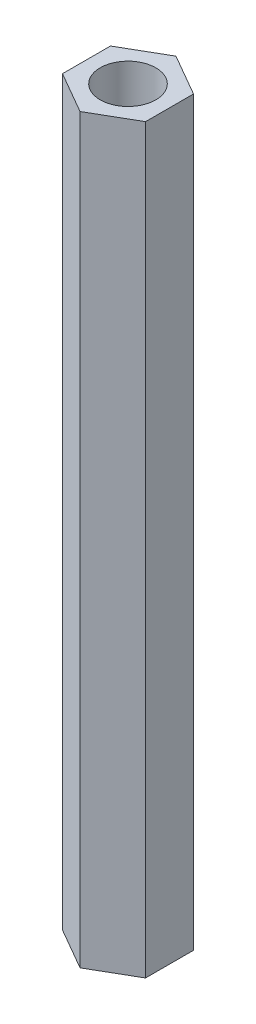
ISO-10303-21;
HEADER;
FILE_DESCRIPTION(('STEP AP214'),'2;1');
FILE_NAME('part.step','',(''),(''),'','','');
FILE_SCHEMA(('AUTOMOTIVE_DESIGN { 1 0 10303 214 1 1 1 1 }'));
ENDSEC;
DATA;
#1=APPLICATION_CONTEXT('core data for automotive mechanical design processes');
#2=APPLICATION_PROTOCOL_DEFINITION('international standard','automotive_design',2000,#1);
#3=PRODUCT_CONTEXT('',#1,'mechanical');
#4=PRODUCT('Part','Part','',(#3));
#5=PRODUCT_RELATED_PRODUCT_CATEGORY('part','',(#4));
#6=PRODUCT_DEFINITION_FORMATION('','',#4);
#7=PRODUCT_DEFINITION_CONTEXT('part definition',#1,'design');
#8=PRODUCT_DEFINITION('design','',#6,#7);
#9=PRODUCT_DEFINITION_SHAPE('','',#8);
#10=(LENGTH_UNIT() NAMED_UNIT(*) SI_UNIT(.MILLI.,.METRE.));
#11=(NAMED_UNIT(*) PLANE_ANGLE_UNIT() SI_UNIT($,.RADIAN.));
#12=(NAMED_UNIT(*) SI_UNIT($,.STERADIAN.) SOLID_ANGLE_UNIT());
#13=UNCERTAINTY_MEASURE_WITH_UNIT(LENGTH_MEASURE(1.E-05),#10,'distance_accuracy_value','');
#14=(GEOMETRIC_REPRESENTATION_CONTEXT(3) GLOBAL_UNCERTAINTY_ASSIGNED_CONTEXT((#13)) GLOBAL_UNIT_ASSIGNED_CONTEXT((#10,
#11,#12)) REPRESENTATION_CONTEXT('',''));
#15=CARTESIAN_POINT('',(0.,0.,0.));
#16=DIRECTION('',(0.,0.,1.));
#17=DIRECTION('',(1.,0.,0.));
#18=AXIS2_PLACEMENT_3D('',#15,#16,#17);
#19=CARTESIAN_POINT('',(0.,31.75,0.));
#20=DIRECTION('',(0.,1.,0.));
#21=DIRECTION('',(0.,0.,1.));
#22=AXIS2_PLACEMENT_3D('',#19,#20,#21);
#23=PLANE('',#22);
#24=DIRECTION('',(0.866025403784438,0.,0.5));
#25=VECTOR('',#24,1.);
#26=CARTESIAN_POINT('',(-1.778,31.75,1.02652877861915));
#27=LINE('',#26,#25);
#28=CARTESIAN_POINT('',(-1.778,31.75,1.02652877861915));
#29=VERTEX_POINT('',#28);
#30=CARTESIAN_POINT('',(0.,31.75,2.05305755723831));
#31=VERTEX_POINT('',#30);
#32=EDGE_CURVE('E129',#29,#31,#27,.T.);
#33=ORIENTED_EDGE('',*,*,#32,.T.);
#34=DIRECTION('',(0.866025403784439,0.,-0.5));
#35=VECTOR('',#34,1.);
#36=CARTESIAN_POINT('',(0.,31.75,2.05305755723831));
#37=LINE('',#36,#35);
#38=CARTESIAN_POINT('',(1.778,31.75,1.02652877861915));
#39=VERTEX_POINT('',#38);
#40=EDGE_CURVE('E87',#31,#39,#37,.T.);
#41=ORIENTED_EDGE('',*,*,#40,.T.);
#42=DIRECTION('',(0.,0.,-1.));
#43=VECTOR('',#42,1.);
#44=CARTESIAN_POINT('',(1.778,31.75,1.02652877861915));
#45=LINE('',#44,#43);
#46=CARTESIAN_POINT('',(1.778,31.75,-1.02652877861915));
#47=VERTEX_POINT('',#46);
#48=EDGE_CURVE('E100',#39,#47,#45,.T.);
#49=ORIENTED_EDGE('',*,*,#48,.T.);
#50=DIRECTION('',(-0.866025403784439,0.,-0.5));
#51=VECTOR('',#50,1.);
#52=CARTESIAN_POINT('',(1.778,31.75,-1.02652877861915));
#53=LINE('',#52,#51);
#54=CARTESIAN_POINT('',(0.,31.75,-2.05305755723831));
#55=VERTEX_POINT('',#54);
#56=EDGE_CURVE('E94',#47,#55,#53,.T.);
#57=ORIENTED_EDGE('',*,*,#56,.T.);
#58=DIRECTION('',(-0.866025403784439,0.,0.5));
#59=VECTOR('',#58,1.);
#60=CARTESIAN_POINT('',(0.,31.75,-2.05305755723831));
#61=LINE('',#60,#59);
#62=CARTESIAN_POINT('',(-1.778,31.75,-1.02652877861915));
#63=VERTEX_POINT('',#62);
#64=EDGE_CURVE('E98',#55,#63,#61,.T.);
#65=ORIENTED_EDGE('',*,*,#64,.T.);
#66=DIRECTION('',(0.,0.,1.));
#67=VECTOR('',#66,1.);
#68=CARTESIAN_POINT('',(-1.778,31.75,-1.02652877861915));
#69=LINE('',#68,#67);
#70=EDGE_CURVE('E50',#63,#29,#69,.T.);
#71=ORIENTED_EDGE('',*,*,#70,.T.);
#72=EDGE_LOOP('',(#33,#41,#49,#57,#65,#71));
#73=FACE_BOUND('',#72,.T.);
#74=CARTESIAN_POINT('',(0.,31.75,0.));
#75=DIRECTION('',(0.,1.,0.));
#76=DIRECTION('',(0.,0.,1.));
#77=AXIS2_PLACEMENT_3D('',#74,#75,#76);
#78=CIRCLE('',#77,1.190625);
#79=CARTESIAN_POINT('',(0.,31.75,1.190625));
#80=VERTEX_POINT('',#79);
#81=EDGE_CURVE('E122',#80,#80,#78,.T.);
#82=ORIENTED_EDGE('',*,*,#81,.F.);
#83=EDGE_LOOP('',(#82));
#84=FACE_BOUND('',#83,.T.);
#85=ADVANCED_FACE('F33',(#73,#84),#23,.T.);
#86=CARTESIAN_POINT('',(0.,0.,0.));
#87=DIRECTION('',(0.,1.,0.));
#88=DIRECTION('',(0.,0.,1.));
#89=AXIS2_PLACEMENT_3D('',#86,#87,#88);
#90=PLANE('',#89);
#91=DIRECTION('',(0.866025403784438,0.,0.5));
#92=VECTOR('',#91,1.);
#93=CARTESIAN_POINT('',(-1.778,0.,1.02652877861915));
#94=LINE('',#93,#92);
#95=CARTESIAN_POINT('',(-1.778,0.,1.02652877861915));
#96=VERTEX_POINT('',#95);
#97=CARTESIAN_POINT('',(0.,0.,2.05305755723831));
#98=VERTEX_POINT('',#97);
#99=EDGE_CURVE('E118',#96,#98,#94,.T.);
#100=ORIENTED_EDGE('',*,*,#99,.F.);
#101=DIRECTION('',(0.,0.,1.));
#102=VECTOR('',#101,1.);
#103=CARTESIAN_POINT('',(-1.778,0.,-1.02652877861915));
#104=LINE('',#103,#102);
#105=CARTESIAN_POINT('',(-1.778,0.,-1.02652877861915));
#106=VERTEX_POINT('',#105);
#107=EDGE_CURVE('E79',#106,#96,#104,.T.);
#108=ORIENTED_EDGE('',*,*,#107,.F.);
#109=DIRECTION('',(-0.866025403784439,0.,0.5));
#110=VECTOR('',#109,1.);
#111=CARTESIAN_POINT('',(0.,0.,-2.05305755723831));
#112=LINE('',#111,#110);
#113=CARTESIAN_POINT('',(0.,0.,-2.05305755723831));
#114=VERTEX_POINT('',#113);
#115=EDGE_CURVE('E73',#114,#106,#112,.T.);
#116=ORIENTED_EDGE('',*,*,#115,.F.);
#117=DIRECTION('',(-0.866025403784439,0.,-0.5));
#118=VECTOR('',#117,1.);
#119=CARTESIAN_POINT('',(1.778,0.,-1.02652877861915));
#120=LINE('',#119,#118);
#121=CARTESIAN_POINT('',(1.778,0.,-1.02652877861915));
#122=VERTEX_POINT('',#121);
#123=EDGE_CURVE('E108',#122,#114,#120,.T.);
#124=ORIENTED_EDGE('',*,*,#123,.F.);
#125=DIRECTION('',(0.,0.,-1.));
#126=VECTOR('',#125,1.);
#127=CARTESIAN_POINT('',(1.778,0.,1.02652877861915));
#128=LINE('',#127,#126);
#129=CARTESIAN_POINT('',(1.778,0.,1.02652877861915));
#130=VERTEX_POINT('',#129);
#131=EDGE_CURVE('E124',#130,#122,#128,.T.);
#132=ORIENTED_EDGE('',*,*,#131,.F.);
#133=DIRECTION('',(0.866025403784439,0.,-0.5));
#134=VECTOR('',#133,1.);
#135=CARTESIAN_POINT('',(0.,0.,2.05305755723831));
#136=LINE('',#135,#134);
#137=EDGE_CURVE('E121',#98,#130,#136,.T.);
#138=ORIENTED_EDGE('',*,*,#137,.F.);
#139=EDGE_LOOP('',(#100,#108,#116,#124,#132,#138));
#140=FACE_BOUND('',#139,.T.);
#141=CARTESIAN_POINT('',(0.,0.,0.));
#142=DIRECTION('',(0.,1.,0.));
#143=DIRECTION('',(0.,0.,1.));
#144=AXIS2_PLACEMENT_3D('',#141,#142,#143);
#145=CIRCLE('',#144,1.190625);
#146=CARTESIAN_POINT('',(0.,0.,1.190625));
#147=VERTEX_POINT('',#146);
#148=EDGE_CURVE('E222',#147,#147,#145,.T.);
#149=ORIENTED_EDGE('',*,*,#148,.T.);
#150=EDGE_LOOP('',(#149));
#151=FACE_BOUND('',#150,.T.);
#152=ADVANCED_FACE('F138',(#140,#151),#90,.F.);
#153=CARTESIAN_POINT('',(-1.778,31.75,1.02652877861915));
#154=DIRECTION('',(0.5,0.,-0.866025403784438));
#155=DIRECTION('',(-0.866025403784439,0.,-0.5));
#156=AXIS2_PLACEMENT_3D('',#153,#154,#155);
#157=PLANE('',#156);
#158=ORIENTED_EDGE('',*,*,#99,.T.);
#159=DIRECTION('',(0.,-1.,0.));
#160=VECTOR('',#159,1.);
#161=CARTESIAN_POINT('',(0.,31.75,2.05305755723831));
#162=LINE('',#161,#160);
#163=EDGE_CURVE('E11',#31,#98,#162,.T.);
#164=ORIENTED_EDGE('',*,*,#163,.F.);
#165=ORIENTED_EDGE('',*,*,#32,.F.);
#166=DIRECTION('',(0.,-1.,0.));
#167=VECTOR('',#166,1.);
#168=CARTESIAN_POINT('',(-1.778,31.75,1.02652877861915));
#169=LINE('',#168,#167);
#170=EDGE_CURVE('E114',#29,#96,#169,.T.);
#171=ORIENTED_EDGE('',*,*,#170,.T.);
#172=EDGE_LOOP('',(#158,#164,#165,#171));
#173=FACE_BOUND('',#172,.T.);
#174=ADVANCED_FACE('F35',(#173),#157,.F.);
#175=CARTESIAN_POINT('',(0.,31.75,2.05305755723831));
#176=DIRECTION('',(-0.5,0.,-0.866025403784439));
#177=DIRECTION('',(-0.866025403784439,0.,0.5));
#178=AXIS2_PLACEMENT_3D('',#175,#176,#177);
#179=PLANE('',#178);
#180=ORIENTED_EDGE('',*,*,#137,.T.);
#181=DIRECTION('',(0.,-1.,0.));
#182=VECTOR('',#181,1.);
#183=CARTESIAN_POINT('',(1.778,31.75,1.02652877861915));
#184=LINE('',#183,#182);
#185=EDGE_CURVE('E42',#39,#130,#184,.T.);
#186=ORIENTED_EDGE('',*,*,#185,.F.);
#187=ORIENTED_EDGE('',*,*,#40,.F.);
#188=ORIENTED_EDGE('',*,*,#163,.T.);
#189=EDGE_LOOP('',(#180,#186,#187,#188));
#190=FACE_BOUND('',#189,.T.);
#191=ADVANCED_FACE('F163',(#190),#179,.F.);
#192=CARTESIAN_POINT('',(1.778,31.75,1.02652877861915));
#193=DIRECTION('',(-1.,0.,0.));
#194=DIRECTION('',(0.,0.,1.));
#195=AXIS2_PLACEMENT_3D('',#192,#193,#194);
#196=PLANE('',#195);
#197=ORIENTED_EDGE('',*,*,#131,.T.);
#198=DIRECTION('',(0.,-1.,0.));
#199=VECTOR('',#198,1.);
#200=CARTESIAN_POINT('',(1.778,31.75,-1.02652877861915));
#201=LINE('',#200,#199);
#202=EDGE_CURVE('E109',#47,#122,#201,.T.);
#203=ORIENTED_EDGE('',*,*,#202,.F.);
#204=ORIENTED_EDGE('',*,*,#48,.F.);
#205=ORIENTED_EDGE('',*,*,#185,.T.);
#206=EDGE_LOOP('',(#197,#203,#204,#205));
#207=FACE_BOUND('',#206,.T.);
#208=ADVANCED_FACE('F135',(#207),#196,.F.);
#209=CARTESIAN_POINT('',(1.778,31.75,-1.02652877861915));
#210=DIRECTION('',(-0.5,0.,0.866025403784439));
#211=DIRECTION('',(0.866025403784439,0.,0.5));
#212=AXIS2_PLACEMENT_3D('',#209,#210,#211);
#213=PLANE('',#212);
#214=ORIENTED_EDGE('',*,*,#123,.T.);
#215=DIRECTION('',(0.,-1.,0.));
#216=VECTOR('',#215,1.);
#217=CARTESIAN_POINT('',(0.,31.75,-2.05305755723831));
#218=LINE('',#217,#216);
#219=EDGE_CURVE('E105',#55,#114,#218,.T.);
#220=ORIENTED_EDGE('',*,*,#219,.F.);
#221=ORIENTED_EDGE('',*,*,#56,.F.);
#222=ORIENTED_EDGE('',*,*,#202,.T.);
#223=EDGE_LOOP('',(#214,#220,#221,#222));
#224=FACE_BOUND('',#223,.T.);
#225=ADVANCED_FACE('F106',(#224),#213,.F.);
#226=CARTESIAN_POINT('',(0.,31.75,-2.05305755723831));
#227=DIRECTION('',(0.5,0.,0.866025403784439));
#228=DIRECTION('',(0.866025403784439,0.,-0.5));
#229=AXIS2_PLACEMENT_3D('',#226,#227,#228);
#230=PLANE('',#229);
#231=ORIENTED_EDGE('',*,*,#115,.T.);
#232=DIRECTION('',(0.,-1.,0.));
#233=VECTOR('',#232,1.);
#234=CARTESIAN_POINT('',(-1.778,31.75,-1.02652877861915));
#235=LINE('',#234,#233);
#236=EDGE_CURVE('E110',#63,#106,#235,.T.);
#237=ORIENTED_EDGE('',*,*,#236,.F.);
#238=ORIENTED_EDGE('',*,*,#64,.F.);
#239=ORIENTED_EDGE('',*,*,#219,.T.);
#240=EDGE_LOOP('',(#231,#237,#238,#239));
#241=FACE_BOUND('',#240,.T.);
#242=ADVANCED_FACE('F112',(#241),#230,.F.);
#243=CARTESIAN_POINT('',(-1.778,31.75,-1.02652877861915));
#244=DIRECTION('',(1.,0.,0.));
#245=DIRECTION('',(0.,0.,-1.));
#246=AXIS2_PLACEMENT_3D('',#243,#244,#245);
#247=PLANE('',#246);
#248=ORIENTED_EDGE('',*,*,#107,.T.);
#249=ORIENTED_EDGE('',*,*,#170,.F.);
#250=ORIENTED_EDGE('',*,*,#70,.F.);
#251=ORIENTED_EDGE('',*,*,#236,.T.);
#252=EDGE_LOOP('',(#248,#249,#250,#251));
#253=FACE_BOUND('',#252,.T.);
#254=ADVANCED_FACE('F143',(#253),#247,.F.);
#255=CARTESIAN_POINT('',(0.,31.75,0.));
#256=DIRECTION('',(0.,-1.,0.));
#257=DIRECTION('',(0.,0.,-1.));
#258=AXIS2_PLACEMENT_3D('',#255,#256,#257);
#259=CYLINDRICAL_SURFACE('',#258,1.190625);
#260=ORIENTED_EDGE('',*,*,#81,.T.);
#261=EDGE_LOOP('',(#260));
#262=FACE_BOUND('',#261,.T.);
#263=ORIENTED_EDGE('',*,*,#148,.F.);
#264=EDGE_LOOP('',(#263));
#265=FACE_BOUND('',#264,.T.);
#266=ADVANCED_FACE('F145',(#262,#265),#259,.F.);
#267=CLOSED_SHELL('',(#85,#152,#174,#191,#208,#225,#242,#254,#266));
#268=MANIFOLD_SOLID_BREP('B2',#267);
#269=ADVANCED_BREP_SHAPE_REPRESENTATION('',(#18,#268),#14);
#270=SHAPE_DEFINITION_REPRESENTATION(#9,#269);
ENDSEC;
END-ISO-10303-21;
